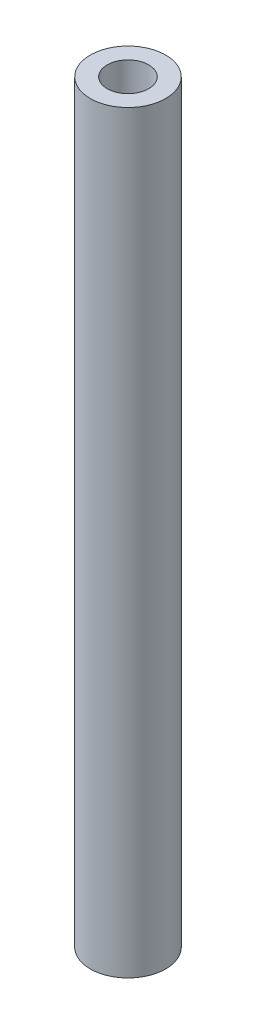
ISO-10303-21;
HEADER;
FILE_DESCRIPTION(('STEP AP214'),'2;1');
FILE_NAME('part.step','',(''),(''),'','','');
FILE_SCHEMA(('AUTOMOTIVE_DESIGN { 1 0 10303 214 1 1 1 1 }'));
ENDSEC;
DATA;
#1=APPLICATION_CONTEXT('core data for automotive mechanical design processes');
#2=APPLICATION_PROTOCOL_DEFINITION('international standard','automotive_design',2000,#1);
#3=PRODUCT_CONTEXT('',#1,'mechanical');
#4=PRODUCT('Part','Part','',(#3));
#5=PRODUCT_RELATED_PRODUCT_CATEGORY('part','',(#4));
#6=PRODUCT_DEFINITION_FORMATION('','',#4);
#7=PRODUCT_DEFINITION_CONTEXT('part definition',#1,'design');
#8=PRODUCT_DEFINITION('design','',#6,#7);
#9=PRODUCT_DEFINITION_SHAPE('','',#8);
#10=(LENGTH_UNIT() NAMED_UNIT(*) SI_UNIT(.MILLI.,.METRE.));
#11=(NAMED_UNIT(*) PLANE_ANGLE_UNIT() SI_UNIT($,.RADIAN.));
#12=(NAMED_UNIT(*) SI_UNIT($,.STERADIAN.) SOLID_ANGLE_UNIT());
#13=UNCERTAINTY_MEASURE_WITH_UNIT(LENGTH_MEASURE(1.E-05),#10,'distance_accuracy_value','');
#14=(GEOMETRIC_REPRESENTATION_CONTEXT(3) GLOBAL_UNCERTAINTY_ASSIGNED_CONTEXT((#13)) GLOBAL_UNIT_ASSIGNED_CONTEXT((#10,
#11,#12)) REPRESENTATION_CONTEXT('',''));
#15=CARTESIAN_POINT('',(0.,0.,0.));
#16=DIRECTION('',(0.,0.,1.));
#17=DIRECTION('',(1.,0.,0.));
#18=AXIS2_PLACEMENT_3D('',#15,#16,#17);
#19=CARTESIAN_POINT('',(0.,40.,0.));
#20=DIRECTION('',(0.,1.,0.));
#21=DIRECTION('',(0.,0.,1.));
#22=AXIS2_PLACEMENT_3D('',#19,#20,#21);
#23=PLANE('',#22);
#24=CARTESIAN_POINT('',(0.,40.,0.));
#25=DIRECTION('',(0.,1.,0.));
#26=DIRECTION('',(0.,0.,1.));
#27=AXIS2_PLACEMENT_3D('',#24,#25,#26);
#28=CIRCLE('',#27,2.);
#29=CARTESIAN_POINT('',(0.,40.,2.));
#30=VERTEX_POINT('',#29);
#31=EDGE_CURVE('E10',#30,#30,#28,.T.);
#32=ORIENTED_EDGE('',*,*,#31,.T.);
#33=EDGE_LOOP('',(#32));
#34=FACE_BOUND('',#33,.T.);
#35=CARTESIAN_POINT('',(0.,40.,0.));
#36=DIRECTION('',(0.,1.,0.));
#37=DIRECTION('',(0.,0.,1.));
#38=AXIS2_PLACEMENT_3D('',#35,#36,#37);
#39=CIRCLE('',#38,1.1);
#40=CARTESIAN_POINT('',(0.,40.,1.1));
#41=VERTEX_POINT('',#40);
#42=EDGE_CURVE('E48',#41,#41,#39,.T.);
#43=ORIENTED_EDGE('',*,*,#42,.F.);
#44=EDGE_LOOP('',(#43));
#45=FACE_BOUND('',#44,.T.);
#46=ADVANCED_FACE('F34',(#34,#45),#23,.T.);
#47=CARTESIAN_POINT('',(0.,0.,0.));
#48=DIRECTION('',(0.,1.,0.));
#49=DIRECTION('',(0.,0.,1.));
#50=AXIS2_PLACEMENT_3D('',#47,#48,#49);
#51=PLANE('',#50);
#52=CARTESIAN_POINT('',(0.,0.,0.));
#53=DIRECTION('',(0.,1.,0.));
#54=DIRECTION('',(0.,0.,1.));
#55=AXIS2_PLACEMENT_3D('',#52,#53,#54);
#56=CIRCLE('',#55,2.);
#57=CARTESIAN_POINT('',(0.,0.,2.));
#58=VERTEX_POINT('',#57);
#59=EDGE_CURVE('E38',#58,#58,#56,.T.);
#60=ORIENTED_EDGE('',*,*,#59,.F.);
#61=EDGE_LOOP('',(#60));
#62=FACE_BOUND('',#61,.T.);
#63=CARTESIAN_POINT('',(0.,0.,0.));
#64=DIRECTION('',(0.,1.,0.));
#65=DIRECTION('',(0.,0.,1.));
#66=AXIS2_PLACEMENT_3D('',#63,#64,#65);
#67=CIRCLE('',#66,1.1);
#68=CARTESIAN_POINT('',(0.,0.,1.1));
#69=VERTEX_POINT('',#68);
#70=EDGE_CURVE('E50',#69,#69,#67,.T.);
#71=ORIENTED_EDGE('',*,*,#70,.T.);
#72=EDGE_LOOP('',(#71));
#73=FACE_BOUND('',#72,.T.);
#74=ADVANCED_FACE('F61',(#62,#73),#51,.F.);
#75=CARTESIAN_POINT('',(0.,40.,0.));
#76=DIRECTION('',(0.,-1.,0.));
#77=DIRECTION('',(0.,0.,-1.));
#78=AXIS2_PLACEMENT_3D('',#75,#76,#77);
#79=CYLINDRICAL_SURFACE('',#78,2.);
#80=ORIENTED_EDGE('',*,*,#31,.F.);
#81=EDGE_LOOP('',(#80));
#82=FACE_BOUND('',#81,.T.);
#83=ORIENTED_EDGE('',*,*,#59,.T.);
#84=EDGE_LOOP('',(#83));
#85=FACE_BOUND('',#84,.T.);
#86=ADVANCED_FACE('F36',(#82,#85),#79,.T.);
#87=CARTESIAN_POINT('',(0.,40.,0.));
#88=DIRECTION('',(0.,-1.,0.));
#89=DIRECTION('',(0.,0.,-1.));
#90=AXIS2_PLACEMENT_3D('',#87,#88,#89);
#91=CYLINDRICAL_SURFACE('',#90,1.1);
#92=ORIENTED_EDGE('',*,*,#42,.T.);
#93=EDGE_LOOP('',(#92));
#94=FACE_BOUND('',#93,.T.);
#95=ORIENTED_EDGE('',*,*,#70,.F.);
#96=EDGE_LOOP('',(#95));
#97=FACE_BOUND('',#96,.T.);
#98=ADVANCED_FACE('F57',(#94,#97),#91,.F.);
#99=CLOSED_SHELL('',(#46,#74,#86,#98));
#100=MANIFOLD_SOLID_BREP('B2',#99);
#101=ADVANCED_BREP_SHAPE_REPRESENTATION('',(#18,#100),#14);
#102=SHAPE_DEFINITION_REPRESENTATION(#9,#101);
ENDSEC;
END-ISO-10303-21;
